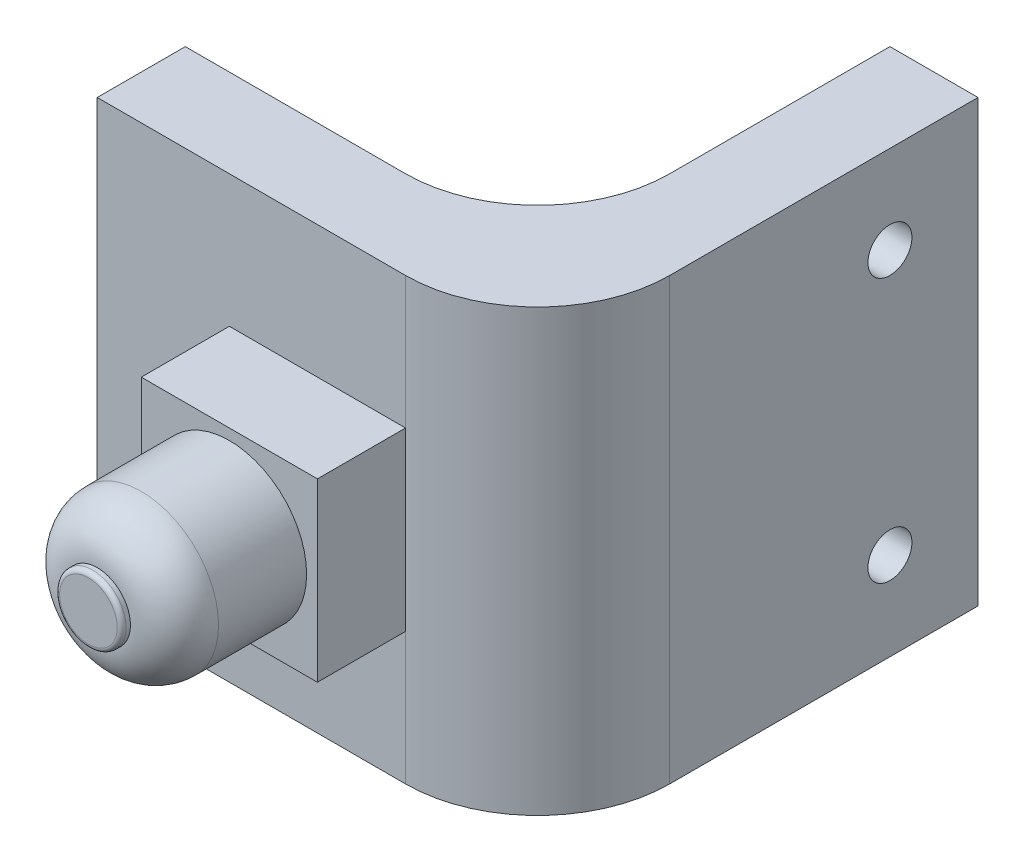
ISO-10303-21;
HEADER;
FILE_DESCRIPTION(('STEP AP214'),'2;1');
FILE_NAME('part.step','',(''),(''),'','','');
FILE_SCHEMA(('AUTOMOTIVE_DESIGN { 1 0 10303 214 1 1 1 1 }'));
ENDSEC;
DATA;
#1=APPLICATION_CONTEXT('core data for automotive mechanical design processes');
#2=APPLICATION_PROTOCOL_DEFINITION('international standard','automotive_design',2000,#1);
#3=PRODUCT_CONTEXT('',#1,'mechanical');
#4=PRODUCT('Part','Part','',(#3));
#5=PRODUCT_RELATED_PRODUCT_CATEGORY('part','',(#4));
#6=PRODUCT_DEFINITION_FORMATION('','',#4);
#7=PRODUCT_DEFINITION_CONTEXT('part definition',#1,'design');
#8=PRODUCT_DEFINITION('design','',#6,#7);
#9=PRODUCT_DEFINITION_SHAPE('','',#8);
#10=(LENGTH_UNIT() NAMED_UNIT(*) SI_UNIT(.MILLI.,.METRE.));
#11=(NAMED_UNIT(*) PLANE_ANGLE_UNIT() SI_UNIT($,.RADIAN.));
#12=(NAMED_UNIT(*) SI_UNIT($,.STERADIAN.) SOLID_ANGLE_UNIT());
#13=UNCERTAINTY_MEASURE_WITH_UNIT(LENGTH_MEASURE(1.E-05),#10,'distance_accuracy_value','');
#14=(GEOMETRIC_REPRESENTATION_CONTEXT(3) GLOBAL_UNCERTAINTY_ASSIGNED_CONTEXT((#13)) GLOBAL_UNIT_ASSIGNED_CONTEXT((#10,
#11,#12)) REPRESENTATION_CONTEXT('',''));
#15=CARTESIAN_POINT('',(0.,0.,0.));
#16=DIRECTION('',(0.,0.,1.));
#17=DIRECTION('',(1.,0.,0.));
#18=AXIS2_PLACEMENT_3D('',#15,#16,#17);
#19=CARTESIAN_POINT('',(25.,25.,25.5));
#20=DIRECTION('',(0.,0.,1.));
#21=DIRECTION('',(1.,0.,0.));
#22=AXIS2_PLACEMENT_3D('',#19,#20,#21);
#23=TOROIDAL_SURFACE('',#22,3.26911389653764,0.5);
#24=CARTESIAN_POINT('',(25.,25.,26.));
#25=DIRECTION('',(0.,0.,1.));
#26=DIRECTION('',(1.,0.,0.));
#27=AXIS2_PLACEMENT_3D('',#24,#25,#26);
#28=CIRCLE('',#27,3.26911389653764);
#29=CARTESIAN_POINT('',(28.2691138965376,25.,26.));
#30=VERTEX_POINT('',#29);
#31=EDGE_CURVE('E51',#30,#30,#28,.T.);
#32=ORIENTED_EDGE('',*,*,#31,.F.);
#33=EDGE_LOOP('',(#32));
#34=FACE_BOUND('',#33,.T.);
#35=CARTESIAN_POINT('',(25.,25.,25.5));
#36=DIRECTION('',(0.,0.,1.));
#37=DIRECTION('',(1.,0.,0.));
#38=AXIS2_PLACEMENT_3D('',#35,#36,#37);
#39=CIRCLE('',#38,3.76911389653764);
#40=CARTESIAN_POINT('',(28.7691138965376,25.,25.5));
#41=VERTEX_POINT('',#40);
#42=EDGE_CURVE('E11',#41,#41,#39,.F.);
#43=ORIENTED_EDGE('',*,*,#42,.F.);
#44=EDGE_LOOP('',(#43));
#45=FACE_BOUND('',#44,.T.);
#46=ADVANCED_FACE('F43',(#34,#45),#23,.T.);
#47=CARTESIAN_POINT('',(35.,50.,-15.));
#48=DIRECTION('',(0.,1.,0.));
#49=DIRECTION('',(0.,0.,1.));
#50=AXIS2_PLACEMENT_3D('',#47,#48,#49);
#51=CYLINDRICAL_SURFACE('',#50,15.);
#52=DIRECTION('',(0.,1.,0.));
#53=VECTOR('',#52,1.);
#54=CARTESIAN_POINT('',(35.,50.,0.));
#55=LINE('',#54,#53);
#56=CARTESIAN_POINT('',(35.,0.,0.));
#57=VERTEX_POINT('',#56);
#58=CARTESIAN_POINT('',(35.,15.,0.));
#59=VERTEX_POINT('',#58);
#60=EDGE_CURVE('E289',#57,#59,#55,.T.);
#61=ORIENTED_EDGE('',*,*,#60,.F.);
#62=CARTESIAN_POINT('',(35.,0.,-15.));
#63=DIRECTION('',(0.,1.,0.));
#64=DIRECTION('',(0.,0.,1.));
#65=AXIS2_PLACEMENT_3D('',#62,#63,#64);
#66=CIRCLE('',#65,15.);
#67=CARTESIAN_POINT('',(50.,0.,-15.));
#68=VERTEX_POINT('',#67);
#69=EDGE_CURVE('E65',#68,#57,#66,.F.);
#70=ORIENTED_EDGE('',*,*,#69,.F.);
#71=DIRECTION('',(0.,1.,0.));
#72=VECTOR('',#71,1.);
#73=CARTESIAN_POINT('',(50.,50.,-15.));
#74=LINE('',#73,#72);
#75=CARTESIAN_POINT('',(50.,50.,-15.));
#76=VERTEX_POINT('',#75);
#77=EDGE_CURVE('E292',#76,#68,#74,.F.);
#78=ORIENTED_EDGE('',*,*,#77,.F.);
#79=CARTESIAN_POINT('',(35.,50.,-15.));
#80=DIRECTION('',(0.,1.,0.));
#81=DIRECTION('',(0.,0.,1.));
#82=AXIS2_PLACEMENT_3D('',#79,#80,#81);
#83=CIRCLE('',#82,15.);
#84=CARTESIAN_POINT('',(35.,50.,0.));
#85=VERTEX_POINT('',#84);
#86=EDGE_CURVE('E58',#85,#76,#83,.T.);
#87=ORIENTED_EDGE('',*,*,#86,.F.);
#88=DIRECTION('',(0.,1.,0.));
#89=VECTOR('',#88,1.);
#90=CARTESIAN_POINT('',(35.,50.,0.));
#91=LINE('',#90,#89);
#92=CARTESIAN_POINT('',(35.,35.,0.));
#93=VERTEX_POINT('',#92);
#94=EDGE_CURVE('E285',#93,#85,#91,.T.);
#95=ORIENTED_EDGE('',*,*,#94,.F.);
#96=DIRECTION('',(0.,-1.,0.));
#97=VECTOR('',#96,1.);
#98=CARTESIAN_POINT('',(35.,35.,0.));
#99=LINE('',#98,#97);
#100=EDGE_CURVE('E174',#93,#59,#99,.T.);
#101=ORIENTED_EDGE('',*,*,#100,.T.);
#102=EDGE_LOOP('',(#61,#70,#78,#87,#95,#101));
#103=FACE_BOUND('',#102,.T.);
#104=ADVANCED_FACE('F306',(#103),#51,.T.);
#105=CARTESIAN_POINT('',(25.,50.,-25.));
#106=DIRECTION('',(0.,-1.,0.));
#107=DIRECTION('',(0.,0.,-1.));
#108=AXIS2_PLACEMENT_3D('',#105,#106,#107);
#109=CYLINDRICAL_SURFACE('',#108,15.);
#110=DIRECTION('',(0.,1.,0.));
#111=VECTOR('',#110,1.);
#112=CARTESIAN_POINT('',(40.,50.,-25.));
#113=LINE('',#112,#111);
#114=CARTESIAN_POINT('',(40.,0.,-25.));
#115=VERTEX_POINT('',#114);
#116=CARTESIAN_POINT('',(40.,50.,-25.));
#117=VERTEX_POINT('',#116);
#118=EDGE_CURVE('E271',#115,#117,#113,.T.);
#119=ORIENTED_EDGE('',*,*,#118,.F.);
#120=CARTESIAN_POINT('',(25.,0.,-25.));
#121=DIRECTION('',(0.,1.,0.));
#122=DIRECTION('',(0.,0.,1.));
#123=AXIS2_PLACEMENT_3D('',#120,#121,#122);
#124=CIRCLE('',#123,15.);
#125=CARTESIAN_POINT('',(25.,0.,-10.));
#126=VERTEX_POINT('',#125);
#127=EDGE_CURVE('E279',#115,#126,#124,.F.);
#128=ORIENTED_EDGE('',*,*,#127,.T.);
#129=DIRECTION('',(0.,1.,0.));
#130=VECTOR('',#129,1.);
#131=CARTESIAN_POINT('',(25.,50.,-10.));
#132=LINE('',#131,#130);
#133=CARTESIAN_POINT('',(25.,50.,-10.));
#134=VERTEX_POINT('',#133);
#135=EDGE_CURVE('E275',#134,#126,#132,.F.);
#136=ORIENTED_EDGE('',*,*,#135,.F.);
#137=CARTESIAN_POINT('',(25.,50.,-25.));
#138=DIRECTION('',(0.,1.,0.));
#139=DIRECTION('',(0.,0.,1.));
#140=AXIS2_PLACEMENT_3D('',#137,#138,#139);
#141=CIRCLE('',#140,15.);
#142=EDGE_CURVE('E282',#134,#117,#141,.T.);
#143=ORIENTED_EDGE('',*,*,#142,.T.);
#144=EDGE_LOOP('',(#119,#128,#136,#143));
#145=FACE_BOUND('',#144,.T.);
#146=ADVANCED_FACE('F320',(#145),#109,.F.);
#147=CARTESIAN_POINT('',(25.,25.,20.));
#148=DIRECTION('',(0.,0.,1.));
#149=DIRECTION('',(1.,0.,0.));
#150=AXIS2_PLACEMENT_3D('',#147,#148,#149);
#151=DEGENERATE_TOROIDAL_SURFACE('',#150,3.76911389653764,5.,.T.);
#152=CARTESIAN_POINT('',(25.,25.,25.));
#153=DIRECTION('',(0.,0.,1.));
#154=DIRECTION('',(1.,0.,0.));
#155=AXIS2_PLACEMENT_3D('',#152,#153,#154);
#156=CIRCLE('',#155,3.76911389653764);
#157=CARTESIAN_POINT('',(28.7691138965376,25.,25.));
#158=VERTEX_POINT('',#157);
#159=EDGE_CURVE('E263',#158,#158,#156,.T.);
#160=ORIENTED_EDGE('',*,*,#159,.F.);
#161=EDGE_LOOP('',(#160));
#162=FACE_BOUND('',#161,.T.);
#163=CARTESIAN_POINT('',(25.,25.,20.));
#164=DIRECTION('',(0.,0.,1.));
#165=DIRECTION('',(1.,0.,0.));
#166=AXIS2_PLACEMENT_3D('',#163,#164,#165);
#167=CIRCLE('',#166,8.76911389653764);
#168=CARTESIAN_POINT('',(33.7691138965376,25.,20.));
#169=VERTEX_POINT('',#168);
#170=EDGE_CURVE('E267',#169,#169,#167,.F.);
#171=ORIENTED_EDGE('',*,*,#170,.F.);
#172=EDGE_LOOP('',(#171));
#173=FACE_BOUND('',#172,.T.);
#174=ADVANCED_FACE('F316',(#162,#173),#151,.T.);
#175=CARTESIAN_POINT('',(0.,50.,0.));
#176=DIRECTION('',(0.,0.,-1.));
#177=DIRECTION('',(-1.,0.,0.));
#178=AXIS2_PLACEMENT_3D('',#175,#176,#177);
#179=PLANE('',#178);
#180=DIRECTION('',(1.,0.,0.));
#181=VECTOR('',#180,1.);
#182=CARTESIAN_POINT('',(0.,0.,0.));
#183=LINE('',#182,#181);
#184=CARTESIAN_POINT('',(0.,0.,0.));
#185=VERTEX_POINT('',#184);
#186=EDGE_CURVE('E231',#185,#57,#183,.T.);
#187=ORIENTED_EDGE('',*,*,#186,.T.);
#188=ORIENTED_EDGE('',*,*,#60,.T.);
#189=DIRECTION('',(1.,0.,0.));
#190=VECTOR('',#189,1.);
#191=CARTESIAN_POINT('',(15.,15.,0.));
#192=LINE('',#191,#190);
#193=CARTESIAN_POINT('',(15.,15.,0.));
#194=VERTEX_POINT('',#193);
#195=EDGE_CURVE('E152',#194,#59,#192,.T.);
#196=ORIENTED_EDGE('',*,*,#195,.F.);
#197=DIRECTION('',(0.,-1.,0.));
#198=VECTOR('',#197,1.);
#199=CARTESIAN_POINT('',(15.,35.,0.));
#200=LINE('',#199,#198);
#201=CARTESIAN_POINT('',(15.,35.,0.));
#202=VERTEX_POINT('',#201);
#203=EDGE_CURVE('E145',#202,#194,#200,.T.);
#204=ORIENTED_EDGE('',*,*,#203,.F.);
#205=DIRECTION('',(1.,0.,0.));
#206=VECTOR('',#205,1.);
#207=CARTESIAN_POINT('',(15.,35.,0.));
#208=LINE('',#207,#206);
#209=EDGE_CURVE('E177',#202,#93,#208,.T.);
#210=ORIENTED_EDGE('',*,*,#209,.T.);
#211=ORIENTED_EDGE('',*,*,#94,.T.);
#212=DIRECTION('',(1.,0.,0.));
#213=VECTOR('',#212,1.);
#214=CARTESIAN_POINT('',(0.,50.,0.));
#215=LINE('',#214,#213);
#216=CARTESIAN_POINT('',(0.,50.,0.));
#217=VERTEX_POINT('',#216);
#218=EDGE_CURVE('E210',#217,#85,#215,.T.);
#219=ORIENTED_EDGE('',*,*,#218,.F.);
#220=DIRECTION('',(0.,-1.,0.));
#221=VECTOR('',#220,1.);
#222=CARTESIAN_POINT('',(0.,50.,0.));
#223=LINE('',#222,#221);
#224=EDGE_CURVE('E258',#217,#185,#223,.T.);
#225=ORIENTED_EDGE('',*,*,#224,.T.);
#226=EDGE_LOOP('',(#187,#188,#196,#204,#210,#211,#219,#225));
#227=FACE_BOUND('',#226,.T.);
#228=ADVANCED_FACE('F319',(#227),#179,.F.);
#229=CARTESIAN_POINT('',(0.,50.,-10.));
#230=DIRECTION('',(1.,0.,0.));
#231=DIRECTION('',(0.,0.,-1.));
#232=AXIS2_PLACEMENT_3D('',#229,#230,#231);
#233=PLANE('',#232);
#234=DIRECTION('',(0.,0.,1.));
#235=VECTOR('',#234,1.);
#236=CARTESIAN_POINT('',(0.,0.,-10.));
#237=LINE('',#236,#235);
#238=CARTESIAN_POINT('',(0.,0.,-10.));
#239=VERTEX_POINT('',#238);
#240=EDGE_CURVE('E205',#239,#185,#237,.T.);
#241=ORIENTED_EDGE('',*,*,#240,.T.);
#242=ORIENTED_EDGE('',*,*,#224,.F.);
#243=DIRECTION('',(0.,0.,1.));
#244=VECTOR('',#243,1.);
#245=CARTESIAN_POINT('',(0.,50.,-10.));
#246=LINE('',#245,#244);
#247=CARTESIAN_POINT('',(0.,50.,-10.));
#248=VERTEX_POINT('',#247);
#249=EDGE_CURVE('E206',#248,#217,#246,.T.);
#250=ORIENTED_EDGE('',*,*,#249,.F.);
#251=DIRECTION('',(0.,-1.,0.));
#252=VECTOR('',#251,1.);
#253=CARTESIAN_POINT('',(0.,50.,-10.));
#254=LINE('',#253,#252);
#255=EDGE_CURVE('E227',#248,#239,#254,.T.);
#256=ORIENTED_EDGE('',*,*,#255,.T.);
#257=EDGE_LOOP('',(#241,#242,#250,#256));
#258=FACE_BOUND('',#257,.T.);
#259=ADVANCED_FACE('F378',(#258),#233,.F.);
#260=CARTESIAN_POINT('',(50.,50.,0.));
#261=DIRECTION('',(-1.,0.,0.));
#262=DIRECTION('',(0.,0.,1.));
#263=AXIS2_PLACEMENT_3D('',#260,#261,#262);
#264=PLANE('',#263);
#265=CARTESIAN_POINT('',(50.,10.,-40.));
#266=DIRECTION('',(-1.,0.,0.));
#267=DIRECTION('',(0.,0.,1.));
#268=AXIS2_PLACEMENT_3D('',#265,#266,#267);
#269=CIRCLE('',#268,2.5);
#270=CARTESIAN_POINT('',(50.,10.,-37.5));
#271=VERTEX_POINT('',#270);
#272=EDGE_CURVE('E201',#271,#271,#269,.T.);
#273=ORIENTED_EDGE('',*,*,#272,.T.);
#274=EDGE_LOOP('',(#273));
#275=FACE_BOUND('',#274,.T.);
#276=CARTESIAN_POINT('',(50.,40.,-40.));
#277=DIRECTION('',(-1.,0.,0.));
#278=DIRECTION('',(0.,0.,1.));
#279=AXIS2_PLACEMENT_3D('',#276,#277,#278);
#280=CIRCLE('',#279,2.5);
#281=CARTESIAN_POINT('',(50.,40.,-37.5));
#282=VERTEX_POINT('',#281);
#283=EDGE_CURVE('E194',#282,#282,#280,.T.);
#284=ORIENTED_EDGE('',*,*,#283,.T.);
#285=EDGE_LOOP('',(#284));
#286=FACE_BOUND('',#285,.T.);
#287=DIRECTION('',(0.,0.,-1.));
#288=VECTOR('',#287,1.);
#289=CARTESIAN_POINT('',(50.,50.,0.));
#290=LINE('',#289,#288);
#291=CARTESIAN_POINT('',(50.,50.,-50.));
#292=VERTEX_POINT('',#291);
#293=EDGE_CURVE('E214',#76,#292,#290,.T.);
#294=ORIENTED_EDGE('',*,*,#293,.F.);
#295=ORIENTED_EDGE('',*,*,#77,.T.);
#296=DIRECTION('',(0.,0.,-1.));
#297=VECTOR('',#296,1.);
#298=CARTESIAN_POINT('',(50.,0.,0.));
#299=LINE('',#298,#297);
#300=CARTESIAN_POINT('',(50.,0.,-50.));
#301=VERTEX_POINT('',#300);
#302=EDGE_CURVE('E235',#68,#301,#299,.T.);
#303=ORIENTED_EDGE('',*,*,#302,.T.);
#304=DIRECTION('',(0.,-1.,0.));
#305=VECTOR('',#304,1.);
#306=CARTESIAN_POINT('',(50.,50.,-50.));
#307=LINE('',#306,#305);
#308=EDGE_CURVE('E254',#292,#301,#307,.T.);
#309=ORIENTED_EDGE('',*,*,#308,.F.);
#310=EDGE_LOOP('',(#294,#295,#303,#309));
#311=FACE_BOUND('',#310,.T.);
#312=ADVANCED_FACE('F374',(#275,#286,#311),#264,.F.);
#313=CARTESIAN_POINT('',(50.,50.,-50.));
#314=DIRECTION('',(0.,0.,1.));
#315=DIRECTION('',(1.,0.,0.));
#316=AXIS2_PLACEMENT_3D('',#313,#314,#315);
#317=PLANE('',#316);
#318=DIRECTION('',(-1.,0.,0.));
#319=VECTOR('',#318,1.);
#320=CARTESIAN_POINT('',(50.,0.,-50.));
#321=LINE('',#320,#319);
#322=CARTESIAN_POINT('',(40.,0.,-50.));
#323=VERTEX_POINT('',#322);
#324=EDGE_CURVE('E238',#301,#323,#321,.T.);
#325=ORIENTED_EDGE('',*,*,#324,.T.);
#326=DIRECTION('',(0.,-1.,0.));
#327=VECTOR('',#326,1.);
#328=CARTESIAN_POINT('',(40.,50.,-50.));
#329=LINE('',#328,#327);
#330=CARTESIAN_POINT('',(40.,50.,-50.));
#331=VERTEX_POINT('',#330);
#332=EDGE_CURVE('E250',#331,#323,#329,.T.);
#333=ORIENTED_EDGE('',*,*,#332,.F.);
#334=DIRECTION('',(-1.,0.,0.));
#335=VECTOR('',#334,1.);
#336=CARTESIAN_POINT('',(50.,50.,-50.));
#337=LINE('',#336,#335);
#338=EDGE_CURVE('E217',#292,#331,#337,.T.);
#339=ORIENTED_EDGE('',*,*,#338,.F.);
#340=ORIENTED_EDGE('',*,*,#308,.T.);
#341=EDGE_LOOP('',(#325,#333,#339,#340));
#342=FACE_BOUND('',#341,.T.);
#343=ADVANCED_FACE('F370',(#342),#317,.F.);
#344=CARTESIAN_POINT('',(40.,50.,-50.));
#345=DIRECTION('',(1.,0.,0.));
#346=DIRECTION('',(0.,0.,-1.));
#347=AXIS2_PLACEMENT_3D('',#344,#345,#346);
#348=PLANE('',#347);
#349=CARTESIAN_POINT('',(40.,10.,-40.));
#350=DIRECTION('',(-1.,0.,0.));
#351=DIRECTION('',(0.,0.,1.));
#352=AXIS2_PLACEMENT_3D('',#349,#350,#351);
#353=CIRCLE('',#352,2.5);
#354=CARTESIAN_POINT('',(40.,10.,-37.5));
#355=VERTEX_POINT('',#354);
#356=EDGE_CURVE('E190',#355,#355,#353,.T.);
#357=ORIENTED_EDGE('',*,*,#356,.F.);
#358=EDGE_LOOP('',(#357));
#359=FACE_BOUND('',#358,.T.);
#360=CARTESIAN_POINT('',(40.,40.,-40.));
#361=DIRECTION('',(-1.,0.,0.));
#362=DIRECTION('',(0.,0.,1.));
#363=AXIS2_PLACEMENT_3D('',#360,#361,#362);
#364=CIRCLE('',#363,2.5);
#365=CARTESIAN_POINT('',(40.,40.,-37.5));
#366=VERTEX_POINT('',#365);
#367=EDGE_CURVE('E157',#366,#366,#364,.T.);
#368=ORIENTED_EDGE('',*,*,#367,.F.);
#369=EDGE_LOOP('',(#368));
#370=FACE_BOUND('',#369,.T.);
#371=DIRECTION('',(0.,0.,1.));
#372=VECTOR('',#371,1.);
#373=CARTESIAN_POINT('',(40.,0.,-50.));
#374=LINE('',#373,#372);
#375=EDGE_CURVE('E241',#323,#115,#374,.T.);
#376=ORIENTED_EDGE('',*,*,#375,.T.);
#377=ORIENTED_EDGE('',*,*,#118,.T.);
#378=DIRECTION('',(0.,0.,1.));
#379=VECTOR('',#378,1.);
#380=CARTESIAN_POINT('',(40.,50.,-50.));
#381=LINE('',#380,#379);
#382=EDGE_CURVE('E220',#331,#117,#381,.T.);
#383=ORIENTED_EDGE('',*,*,#382,.F.);
#384=ORIENTED_EDGE('',*,*,#332,.T.);
#385=EDGE_LOOP('',(#376,#377,#383,#384));
#386=FACE_BOUND('',#385,.T.);
#387=ADVANCED_FACE('F366',(#359,#370,#386),#348,.F.);
#388=CARTESIAN_POINT('',(40.,50.,-10.));
#389=DIRECTION('',(0.,0.,1.));
#390=DIRECTION('',(1.,0.,0.));
#391=AXIS2_PLACEMENT_3D('',#388,#389,#390);
#392=PLANE('',#391);
#393=DIRECTION('',(-1.,0.,0.));
#394=VECTOR('',#393,1.);
#395=CARTESIAN_POINT('',(40.,50.,-10.));
#396=LINE('',#395,#394);
#397=EDGE_CURVE('E224',#134,#248,#396,.T.);
#398=ORIENTED_EDGE('',*,*,#397,.F.);
#399=ORIENTED_EDGE('',*,*,#135,.T.);
#400=DIRECTION('',(-1.,0.,0.));
#401=VECTOR('',#400,1.);
#402=CARTESIAN_POINT('',(40.,0.,-10.));
#403=LINE('',#402,#401);
#404=EDGE_CURVE('E211',#126,#239,#403,.T.);
#405=ORIENTED_EDGE('',*,*,#404,.T.);
#406=ORIENTED_EDGE('',*,*,#255,.F.);
#407=EDGE_LOOP('',(#398,#399,#405,#406));
#408=FACE_BOUND('',#407,.T.);
#409=ADVANCED_FACE('F360',(#408),#392,.F.);
#410=CARTESIAN_POINT('',(0.,50.,0.));
#411=DIRECTION('',(0.,1.,0.));
#412=DIRECTION('',(0.,0.,1.));
#413=AXIS2_PLACEMENT_3D('',#410,#411,#412);
#414=PLANE('',#413);
#415=ORIENTED_EDGE('',*,*,#218,.T.);
#416=ORIENTED_EDGE('',*,*,#86,.T.);
#417=ORIENTED_EDGE('',*,*,#293,.T.);
#418=ORIENTED_EDGE('',*,*,#338,.T.);
#419=ORIENTED_EDGE('',*,*,#382,.T.);
#420=ORIENTED_EDGE('',*,*,#142,.F.);
#421=ORIENTED_EDGE('',*,*,#397,.T.);
#422=ORIENTED_EDGE('',*,*,#249,.T.);
#423=EDGE_LOOP('',(#415,#416,#417,#418,#419,#420,#421,#422));
#424=FACE_BOUND('',#423,.T.);
#425=ADVANCED_FACE('F357',(#424),#414,.T.);
#426=CARTESIAN_POINT('',(0.,0.,0.));
#427=DIRECTION('',(0.,1.,0.));
#428=DIRECTION('',(0.,0.,1.));
#429=AXIS2_PLACEMENT_3D('',#426,#427,#428);
#430=PLANE('',#429);
#431=ORIENTED_EDGE('',*,*,#302,.F.);
#432=ORIENTED_EDGE('',*,*,#69,.T.);
#433=ORIENTED_EDGE('',*,*,#186,.F.);
#434=ORIENTED_EDGE('',*,*,#240,.F.);
#435=ORIENTED_EDGE('',*,*,#404,.F.);
#436=ORIENTED_EDGE('',*,*,#127,.F.);
#437=ORIENTED_EDGE('',*,*,#375,.F.);
#438=ORIENTED_EDGE('',*,*,#324,.F.);
#439=EDGE_LOOP('',(#431,#432,#433,#434,#435,#436,#437,#438));
#440=FACE_BOUND('',#439,.T.);
#441=ADVANCED_FACE('F355',(#440),#430,.F.);
#442=CARTESIAN_POINT('',(90.,40.,-40.));
#443=DIRECTION('',(-1.,0.,0.));
#444=DIRECTION('',(0.,0.,1.));
#445=AXIS2_PLACEMENT_3D('',#442,#443,#444);
#446=CYLINDRICAL_SURFACE('',#445,2.5);
#447=ORIENTED_EDGE('',*,*,#367,.T.);
#448=EDGE_LOOP('',(#447));
#449=FACE_BOUND('',#448,.T.);
#450=ORIENTED_EDGE('',*,*,#283,.F.);
#451=EDGE_LOOP('',(#450));
#452=FACE_BOUND('',#451,.T.);
#453=ADVANCED_FACE('F351',(#449,#452),#446,.F.);
#454=CARTESIAN_POINT('',(90.,10.,-40.));
#455=DIRECTION('',(-1.,0.,0.));
#456=DIRECTION('',(0.,0.,1.));
#457=AXIS2_PLACEMENT_3D('',#454,#455,#456);
#458=CYLINDRICAL_SURFACE('',#457,2.5);
#459=ORIENTED_EDGE('',*,*,#356,.T.);
#460=EDGE_LOOP('',(#459));
#461=FACE_BOUND('',#460,.T.);
#462=ORIENTED_EDGE('',*,*,#272,.F.);
#463=EDGE_LOOP('',(#462));
#464=FACE_BOUND('',#463,.T.);
#465=ADVANCED_FACE('F348',(#461,#464),#458,.F.);
#466=CARTESIAN_POINT('',(15.,15.,10.));
#467=DIRECTION('',(0.,1.,0.));
#468=DIRECTION('',(0.,0.,1.));
#469=AXIS2_PLACEMENT_3D('',#466,#467,#468);
#470=PLANE('',#469);
#471=ORIENTED_EDGE('',*,*,#195,.T.);
#472=DIRECTION('',(0.,0.,-1.));
#473=VECTOR('',#472,1.);
#474=CARTESIAN_POINT('',(35.,15.,10.));
#475=LINE('',#474,#473);
#476=CARTESIAN_POINT('',(35.,15.,10.));
#477=VERTEX_POINT('',#476);
#478=EDGE_CURVE('E149',#477,#59,#475,.T.);
#479=ORIENTED_EDGE('',*,*,#478,.F.);
#480=DIRECTION('',(1.,0.,0.));
#481=VECTOR('',#480,1.);
#482=CARTESIAN_POINT('',(15.,15.,10.));
#483=LINE('',#482,#481);
#484=CARTESIAN_POINT('',(15.,15.,10.));
#485=VERTEX_POINT('',#484);
#486=EDGE_CURVE('E132',#485,#477,#483,.T.);
#487=ORIENTED_EDGE('',*,*,#486,.F.);
#488=DIRECTION('',(0.,0.,-1.));
#489=VECTOR('',#488,1.);
#490=CARTESIAN_POINT('',(15.,15.,10.));
#491=LINE('',#490,#489);
#492=EDGE_CURVE('E171',#485,#194,#491,.T.);
#493=ORIENTED_EDGE('',*,*,#492,.T.);
#494=EDGE_LOOP('',(#471,#479,#487,#493));
#495=FACE_BOUND('',#494,.T.);
#496=ADVANCED_FACE('F150',(#495),#470,.F.);
#497=CARTESIAN_POINT('',(35.,35.,10.));
#498=DIRECTION('',(1.,0.,0.));
#499=DIRECTION('',(0.,0.,-1.));
#500=AXIS2_PLACEMENT_3D('',#497,#498,#499);
#501=PLANE('',#500);
#502=ORIENTED_EDGE('',*,*,#100,.F.);
#503=DIRECTION('',(0.,0.,-1.));
#504=VECTOR('',#503,1.);
#505=CARTESIAN_POINT('',(35.,35.,10.));
#506=LINE('',#505,#504);
#507=CARTESIAN_POINT('',(35.,35.,10.));
#508=VERTEX_POINT('',#507);
#509=EDGE_CURVE('E158',#508,#93,#506,.T.);
#510=ORIENTED_EDGE('',*,*,#509,.F.);
#511=DIRECTION('',(0.,-1.,0.));
#512=VECTOR('',#511,1.);
#513=CARTESIAN_POINT('',(35.,35.,10.));
#514=LINE('',#513,#512);
#515=EDGE_CURVE('E137',#508,#477,#514,.T.);
#516=ORIENTED_EDGE('',*,*,#515,.T.);
#517=ORIENTED_EDGE('',*,*,#478,.T.);
#518=EDGE_LOOP('',(#502,#510,#516,#517));
#519=FACE_BOUND('',#518,.T.);
#520=ADVANCED_FACE('F160',(#519),#501,.T.);
#521=CARTESIAN_POINT('',(15.,35.,10.));
#522=DIRECTION('',(0.,1.,0.));
#523=DIRECTION('',(0.,0.,1.));
#524=AXIS2_PLACEMENT_3D('',#521,#522,#523);
#525=PLANE('',#524);
#526=ORIENTED_EDGE('',*,*,#209,.F.);
#527=DIRECTION('',(0.,0.,-1.));
#528=VECTOR('',#527,1.);
#529=CARTESIAN_POINT('',(15.,35.,10.));
#530=LINE('',#529,#528);
#531=CARTESIAN_POINT('',(15.,35.,10.));
#532=VERTEX_POINT('',#531);
#533=EDGE_CURVE('E185',#532,#202,#530,.T.);
#534=ORIENTED_EDGE('',*,*,#533,.F.);
#535=DIRECTION('',(1.,0.,0.));
#536=VECTOR('',#535,1.);
#537=CARTESIAN_POINT('',(15.,35.,10.));
#538=LINE('',#537,#536);
#539=EDGE_CURVE('E163',#532,#508,#538,.T.);
#540=ORIENTED_EDGE('',*,*,#539,.T.);
#541=ORIENTED_EDGE('',*,*,#509,.T.);
#542=EDGE_LOOP('',(#526,#534,#540,#541));
#543=FACE_BOUND('',#542,.T.);
#544=ADVANCED_FACE('F337',(#543),#525,.T.);
#545=CARTESIAN_POINT('',(15.,35.,10.));
#546=DIRECTION('',(1.,0.,0.));
#547=DIRECTION('',(0.,1.,0.));
#548=AXIS2_PLACEMENT_3D('',#545,#546,#547);
#549=PLANE('',#548);
#550=ORIENTED_EDGE('',*,*,#203,.T.);
#551=ORIENTED_EDGE('',*,*,#492,.F.);
#552=DIRECTION('',(0.,-1.,0.));
#553=VECTOR('',#552,1.);
#554=CARTESIAN_POINT('',(15.,35.,10.));
#555=LINE('',#554,#553);
#556=EDGE_CURVE('E140',#532,#485,#555,.T.);
#557=ORIENTED_EDGE('',*,*,#556,.F.);
#558=ORIENTED_EDGE('',*,*,#533,.T.);
#559=EDGE_LOOP('',(#550,#551,#557,#558));
#560=FACE_BOUND('',#559,.T.);
#561=ADVANCED_FACE('F332',(#560),#549,.F.);
#562=CARTESIAN_POINT('',(0.,0.,10.));
#563=DIRECTION('',(0.,0.,-1.));
#564=DIRECTION('',(-1.,0.,0.));
#565=AXIS2_PLACEMENT_3D('',#562,#563,#564);
#566=PLANE('',#565);
#567=CARTESIAN_POINT('',(25.,25.,10.));
#568=DIRECTION('',(0.,0.,1.));
#569=DIRECTION('',(1.,0.,0.));
#570=AXIS2_PLACEMENT_3D('',#567,#568,#569);
#571=CIRCLE('',#570,8.76911389653764);
#572=CARTESIAN_POINT('',(33.7691138965376,25.,10.));
#573=VERTEX_POINT('',#572);
#574=EDGE_CURVE('E262',#573,#573,#571,.T.);
#575=ORIENTED_EDGE('',*,*,#574,.F.);
#576=EDGE_LOOP('',(#575));
#577=FACE_BOUND('',#576,.T.);
#578=ORIENTED_EDGE('',*,*,#486,.T.);
#579=ORIENTED_EDGE('',*,*,#515,.F.);
#580=ORIENTED_EDGE('',*,*,#539,.F.);
#581=ORIENTED_EDGE('',*,*,#556,.T.);
#582=EDGE_LOOP('',(#578,#579,#580,#581));
#583=FACE_BOUND('',#582,.T.);
#584=ADVANCED_FACE('F134',(#577,#583),#566,.F.);
#585=CARTESIAN_POINT('',(25.,25.,25.));
#586=DIRECTION('',(0.,0.,-1.));
#587=DIRECTION('',(-1.,0.,0.));
#588=AXIS2_PLACEMENT_3D('',#585,#586,#587);
#589=CYLINDRICAL_SURFACE('',#588,8.76911389653764);
#590=ORIENTED_EDGE('',*,*,#170,.T.);
#591=EDGE_LOOP('',(#590));
#592=FACE_BOUND('',#591,.T.);
#593=ORIENTED_EDGE('',*,*,#574,.T.);
#594=EDGE_LOOP('',(#593));
#595=FACE_BOUND('',#594,.T.);
#596=ADVANCED_FACE('F312',(#592,#595),#589,.T.);
#597=CARTESIAN_POINT('',(25.,25.,26.));
#598=DIRECTION('',(0.,0.,-1.));
#599=DIRECTION('',(-1.,0.,0.));
#600=AXIS2_PLACEMENT_3D('',#597,#598,#599);
#601=CYLINDRICAL_SURFACE('',#600,3.76911389653764);
#602=ORIENTED_EDGE('',*,*,#42,.T.);
#603=EDGE_LOOP('',(#602));
#604=FACE_BOUND('',#603,.T.);
#605=ORIENTED_EDGE('',*,*,#159,.T.);
#606=EDGE_LOOP('',(#605));
#607=FACE_BOUND('',#606,.T.);
#608=ADVANCED_FACE('F309',(#604,#607),#601,.T.);
#609=CARTESIAN_POINT('',(25.,25.,26.));
#610=DIRECTION('',(0.,0.,1.));
#611=DIRECTION('',(1.,0.,0.));
#612=AXIS2_PLACEMENT_3D('',#609,#610,#611);
#613=PLANE('',#612);
#614=ORIENTED_EDGE('',*,*,#31,.T.);
#615=EDGE_LOOP('',(#614));
#616=FACE_BOUND('',#615,.T.);
#617=ADVANCED_FACE('F302',(#616),#613,.T.);
#618=CLOSED_SHELL('',(#46,#104,#146,#174,#228,#259,#312,#343,#387,#409,#425,#441,#453,#465,#496,
#520,#544,#561,#584,#596,#608,#617));
#619=MANIFOLD_SOLID_BREP('B2',#618);
#620=ADVANCED_BREP_SHAPE_REPRESENTATION('',(#18,#619),#14);
#621=SHAPE_DEFINITION_REPRESENTATION(#9,#620);
ENDSEC;
END-ISO-10303-21;
